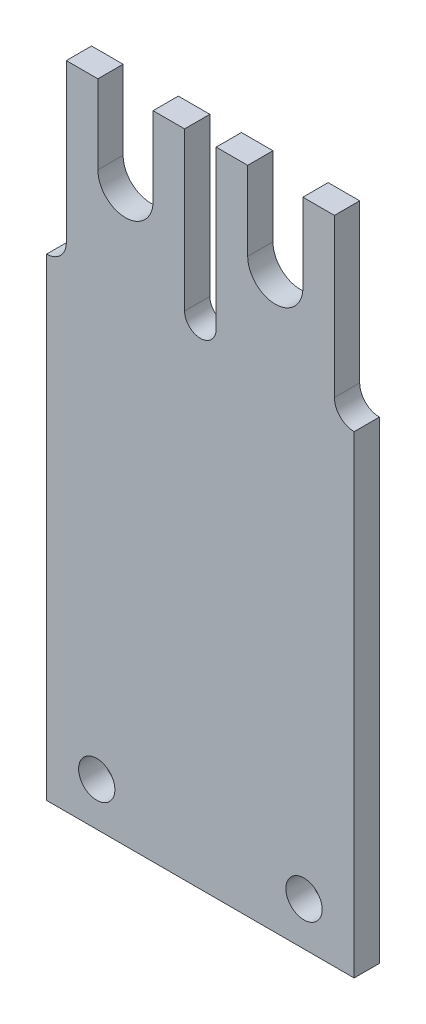
ISO-10303-21;
HEADER;
FILE_DESCRIPTION(('STEP AP214'),'2;1');
FILE_NAME('part.step','',(''),(''),'','','');
FILE_SCHEMA(('AUTOMOTIVE_DESIGN { 1 0 10303 214 1 1 1 1 }'));
ENDSEC;
DATA;
#1=APPLICATION_CONTEXT('core data for automotive mechanical design processes');
#2=APPLICATION_PROTOCOL_DEFINITION('international standard','automotive_design',2000,#1);
#3=PRODUCT_CONTEXT('',#1,'mechanical');
#4=PRODUCT('Part','Part','',(#3));
#5=PRODUCT_RELATED_PRODUCT_CATEGORY('part','',(#4));
#6=PRODUCT_DEFINITION_FORMATION('','',#4);
#7=PRODUCT_DEFINITION_CONTEXT('part definition',#1,'design');
#8=PRODUCT_DEFINITION('design','',#6,#7);
#9=PRODUCT_DEFINITION_SHAPE('','',#8);
#10=(LENGTH_UNIT() NAMED_UNIT(*) SI_UNIT(.MILLI.,.METRE.));
#11=(NAMED_UNIT(*) PLANE_ANGLE_UNIT() SI_UNIT($,.RADIAN.));
#12=(NAMED_UNIT(*) SI_UNIT($,.STERADIAN.) SOLID_ANGLE_UNIT());
#13=UNCERTAINTY_MEASURE_WITH_UNIT(LENGTH_MEASURE(1.E-05),#10,'distance_accuracy_value','');
#14=(GEOMETRIC_REPRESENTATION_CONTEXT(3) GLOBAL_UNCERTAINTY_ASSIGNED_CONTEXT((#13)) GLOBAL_UNIT_ASSIGNED_CONTEXT((#10,
#11,#12)) REPRESENTATION_CONTEXT('',''));
#15=CARTESIAN_POINT('',(0.,0.,0.));
#16=DIRECTION('',(0.,0.,1.));
#17=DIRECTION('',(1.,0.,0.));
#18=AXIS2_PLACEMENT_3D('',#15,#16,#17);
#19=CARTESIAN_POINT('',(-9.75000082,-30.25000046,1.60143952));
#20=DIRECTION('',(0.,0.,1.));
#21=DIRECTION('',(1.,0.,0.));
#22=AXIS2_PLACEMENT_3D('',#19,#20,#21);
#23=PLANE('',#22);
#24=CARTESIAN_POINT('',(6.56999702,-27.4999958,1.60143952));
#25=DIRECTION('',(0.,0.,-1.));
#26=DIRECTION('',(-1.,0.,0.));
#27=AXIS2_PLACEMENT_3D('',#24,#25,#26);
#28=CIRCLE('',#27,1.15000024);
#29=CARTESIAN_POINT('',(5.41999678,-27.4999958,1.60143952));
#30=VERTEX_POINT('',#29);
#31=EDGE_CURVE('E170',#30,#30,#28,.T.);
#32=ORIENTED_EDGE('',*,*,#31,.T.);
#33=EDGE_LOOP('',(#32));
#34=FACE_BOUND('',#33,.T.);
#35=CARTESIAN_POINT('',(-6.5700021,-27.4999958,1.60143952));
#36=DIRECTION('',(0.,0.,-1.));
#37=DIRECTION('',(-1.,0.,0.));
#38=AXIS2_PLACEMENT_3D('',#35,#36,#37);
#39=CIRCLE('',#38,1.15000024);
#40=CARTESIAN_POINT('',(-7.72000234,-27.4999958,1.60143952));
#41=VERTEX_POINT('',#40);
#42=EDGE_CURVE('E240',#41,#41,#39,.T.);
#43=ORIENTED_EDGE('',*,*,#42,.T.);
#44=EDGE_LOOP('',(#43));
#45=FACE_BOUND('',#44,.T.);
#46=CARTESIAN_POINT('',(-9.749997626926,0.999997346926,1.60143952));
#47=DIRECTION('',(0.,0.,-1.));
#48=DIRECTION('',(-1.,0.,0.));
#49=AXIS2_PLACEMENT_3D('',#46,#47,#48);
#50=CIRCLE('',#49,1.24999684693);
#51=CARTESIAN_POINT('',(-8.50000078000004,0.999998943463,1.60143952));
#52=VERTEX_POINT('',#51);
#53=CARTESIAN_POINT('',(-9.75000082,-0.249999499999961,1.60143952));
#54=VERTEX_POINT('',#53);
#55=EDGE_CURVE('E178',#52,#54,#50,.T.);
#56=ORIENTED_EDGE('',*,*,#55,.T.);
#57=DIRECTION('',(0.,1.,0.));
#58=VECTOR('',#57,1.);
#59=CARTESIAN_POINT('',(-9.75000082,-30.25000046,1.60143952));
#60=LINE('',#59,#58);
#61=CARTESIAN_POINT('',(-9.75000082,-30.25000046,1.60143952));
#62=VERTEX_POINT('',#61);
#63=EDGE_CURVE('E177',#62,#54,#60,.T.);
#64=ORIENTED_EDGE('',*,*,#63,.F.);
#65=DIRECTION('',(1.,0.,0.));
#66=VECTOR('',#65,1.);
#67=CARTESIAN_POINT('',(9.75000082,-30.25000046,1.60143952));
#68=LINE('',#67,#66);
#69=CARTESIAN_POINT('',(9.75000082,-30.25000046,1.60143952));
#70=VERTEX_POINT('',#69);
#71=EDGE_CURVE('E175',#70,#62,#68,.F.);
#72=ORIENTED_EDGE('',*,*,#71,.F.);
#73=DIRECTION('',(0.,1.,0.));
#74=VECTOR('',#73,1.);
#75=CARTESIAN_POINT('',(9.75000082,-0.2499995,1.60143952));
#76=LINE('',#75,#74);
#77=CARTESIAN_POINT('',(9.75000082,-0.249999499999922,1.60143952));
#78=VERTEX_POINT('',#77);
#79=EDGE_CURVE('E112',#78,#70,#76,.F.);
#80=ORIENTED_EDGE('',*,*,#79,.F.);
#81=CARTESIAN_POINT('',(9.749997626926,0.999997346926,1.60143952));
#82=DIRECTION('',(0.,0.,-1.));
#83=DIRECTION('',(-1.,0.,0.));
#84=AXIS2_PLACEMENT_3D('',#81,#82,#83);
#85=CIRCLE('',#84,1.24999684693);
#86=CARTESIAN_POINT('',(8.50000078,0.999998943463,1.60143952));
#87=VERTEX_POINT('',#86);
#88=EDGE_CURVE('E20',#78,#87,#85,.T.);
#89=ORIENTED_EDGE('',*,*,#88,.T.);
#90=DIRECTION('',(0.,1.,0.));
#91=VECTOR('',#90,1.);
#92=CARTESIAN_POINT('',(8.50000078,11.00000086,1.60143952));
#93=LINE('',#92,#91);
#94=CARTESIAN_POINT('',(8.50000078,11.00000086,1.60143952));
#95=VERTEX_POINT('',#94);
#96=EDGE_CURVE('E328',#95,#87,#93,.F.);
#97=ORIENTED_EDGE('',*,*,#96,.F.);
#98=DIRECTION('',(1.,0.,0.));
#99=VECTOR('',#98,1.);
#100=CARTESIAN_POINT('',(6.4999997,11.00000086,1.60143952));
#101=LINE('',#100,#99);
#102=CARTESIAN_POINT('',(6.4999997,11.00000086,1.60143952));
#103=VERTEX_POINT('',#102);
#104=EDGE_CURVE('E323',#103,#95,#101,.T.);
#105=ORIENTED_EDGE('',*,*,#104,.F.);
#106=DIRECTION('',(0.,1.,0.));
#107=VECTOR('',#106,1.);
#108=CARTESIAN_POINT('',(6.4999997,6.0000007,1.60143952));
#109=LINE('',#108,#107);
#110=CARTESIAN_POINT('',(6.4999997,6.0000007,1.60143952));
#111=VERTEX_POINT('',#110);
#112=EDGE_CURVE('E314',#111,#103,#109,.T.);
#113=ORIENTED_EDGE('',*,*,#112,.F.);
#114=CARTESIAN_POINT('',(4.75000066,6.0000007,1.60143952));
#115=DIRECTION('',(0.,0.,-1.));
#116=DIRECTION('',(-1.,0.,0.));
#117=AXIS2_PLACEMENT_3D('',#114,#115,#116);
#118=CIRCLE('',#117,1.74999904);
#119=CARTESIAN_POINT('',(3.00000162000023,6.00000025550026,1.60143952));
#120=VERTEX_POINT('',#119);
#121=EDGE_CURVE('E311',#111,#120,#118,.T.);
#122=ORIENTED_EDGE('',*,*,#121,.T.);
#123=DIRECTION('',(-5.07999983765134E-07,0.999999999999871,0.));
#124=VECTOR('',#123,1.);
#125=CARTESIAN_POINT('',(2.99999908,11.00000086,1.60143952));
#126=LINE('',#125,#124);
#127=CARTESIAN_POINT('',(2.99999908,11.00000086,1.60143952));
#128=VERTEX_POINT('',#127);
#129=EDGE_CURVE('E307',#128,#120,#126,.F.);
#130=ORIENTED_EDGE('',*,*,#129,.F.);
#131=DIRECTION('',(1.,0.,0.));
#132=VECTOR('',#131,1.);
#133=CARTESIAN_POINT('',(1.00000054,11.00000086,1.60143952));
#134=LINE('',#133,#132);
#135=CARTESIAN_POINT('',(1.00000054,11.00000086,1.60143952));
#136=VERTEX_POINT('',#135);
#137=EDGE_CURVE('E302',#136,#128,#134,.T.);
#138=ORIENTED_EDGE('',*,*,#137,.F.);
#139=DIRECTION('',(0.,1.,0.));
#140=VECTOR('',#139,1.);
#141=CARTESIAN_POINT('',(1.00000054,1.00000054,1.60143952));
#142=LINE('',#141,#140);
#143=CARTESIAN_POINT('',(1.00000054,1.00000054,1.60143952));
#144=VERTEX_POINT('',#143);
#145=EDGE_CURVE('E293',#144,#136,#142,.T.);
#146=ORIENTED_EDGE('',*,*,#145,.F.);
#147=CARTESIAN_POINT('',(0.,1.00000054,1.60143952));
#148=DIRECTION('',(0.,0.,-1.));
#149=DIRECTION('',(-1.,0.,0.));
#150=AXIS2_PLACEMENT_3D('',#147,#148,#149);
#151=CIRCLE('',#150,1.00000054);
#152=CARTESIAN_POINT('',(-1.00000054,1.00000054,1.60143952));
#153=VERTEX_POINT('',#152);
#154=EDGE_CURVE('E290',#144,#153,#151,.T.);
#155=ORIENTED_EDGE('',*,*,#154,.T.);
#156=DIRECTION('',(0.,1.,0.));
#157=VECTOR('',#156,1.);
#158=CARTESIAN_POINT('',(-1.00000054,11.00000086,1.60143952));
#159=LINE('',#158,#157);
#160=CARTESIAN_POINT('',(-1.00000054,11.00000086,1.60143952));
#161=VERTEX_POINT('',#160);
#162=EDGE_CURVE('E286',#161,#153,#159,.F.);
#163=ORIENTED_EDGE('',*,*,#162,.F.);
#164=DIRECTION('',(1.,0.,0.));
#165=VECTOR('',#164,1.);
#166=CARTESIAN_POINT('',(-3.00000162,11.00000086,1.60143952));
#167=LINE('',#166,#165);
#168=CARTESIAN_POINT('',(-3.00000162,11.00000086,1.60143952));
#169=VERTEX_POINT('',#168);
#170=EDGE_CURVE('E281',#169,#161,#167,.T.);
#171=ORIENTED_EDGE('',*,*,#170,.F.);
#172=DIRECTION('',(0.,1.,0.));
#173=VECTOR('',#172,1.);
#174=CARTESIAN_POINT('',(-3.00000162,6.0000007,1.60143952));
#175=LINE('',#174,#173);
#176=CARTESIAN_POINT('',(-3.00000162,6.0000007,1.60143952));
#177=VERTEX_POINT('',#176);
#178=EDGE_CURVE('E272',#177,#169,#175,.T.);
#179=ORIENTED_EDGE('',*,*,#178,.F.);
#180=CARTESIAN_POINT('',(-4.75000066,6.0000007,1.60143952));
#181=DIRECTION('',(0.,0.,-1.));
#182=DIRECTION('',(-1.,0.,0.));
#183=AXIS2_PLACEMENT_3D('',#180,#181,#182);
#184=CIRCLE('',#183,1.74999904);
#185=CARTESIAN_POINT('',(-6.4999997,6.0000007,1.60143952));
#186=VERTEX_POINT('',#185);
#187=EDGE_CURVE('E269',#177,#186,#184,.T.);
#188=ORIENTED_EDGE('',*,*,#187,.T.);
#189=DIRECTION('',(0.,1.,0.));
#190=VECTOR('',#189,1.);
#191=CARTESIAN_POINT('',(-6.4999997,11.00000086,1.60143952));
#192=LINE('',#191,#190);
#193=CARTESIAN_POINT('',(-6.4999997,11.00000086,1.60143952));
#194=VERTEX_POINT('',#193);
#195=EDGE_CURVE('E265',#194,#186,#192,.F.);
#196=ORIENTED_EDGE('',*,*,#195,.F.);
#197=DIRECTION('',(1.,0.,0.));
#198=VECTOR('',#197,1.);
#199=CARTESIAN_POINT('',(-8.50000078,11.00000086,1.60143952));
#200=LINE('',#199,#198);
#201=CARTESIAN_POINT('',(-8.50000078,11.00000086,1.60143952));
#202=VERTEX_POINT('',#201);
#203=EDGE_CURVE('E260',#202,#194,#200,.T.);
#204=ORIENTED_EDGE('',*,*,#203,.F.);
#205=DIRECTION('',(0.,1.,0.));
#206=VECTOR('',#205,1.);
#207=CARTESIAN_POINT('',(-8.50000078,1.00000054,1.60143952));
#208=LINE('',#207,#206);
#209=EDGE_CURVE('E251',#52,#202,#208,.T.);
#210=ORIENTED_EDGE('',*,*,#209,.F.);
#211=EDGE_LOOP('',(#56,#64,#72,#80,#89,#97,#105,#113,#122,#130,#138,#146,#155,#163,#171,#179,
#188,#196,#204,#210));
#212=FACE_BOUND('',#211,.T.);
#213=ADVANCED_FACE('F17',(#34,#45,#212),#23,.T.);
#214=CARTESIAN_POINT('',(9.75000082,-30.25000046,0.));
#215=DIRECTION('',(0.,-1.,0.));
#216=DIRECTION('',(0.,0.,-1.));
#217=AXIS2_PLACEMENT_3D('',#214,#215,#216);
#218=PLANE('',#217);
#219=DIRECTION('',(0.,0.,1.));
#220=VECTOR('',#219,1.);
#221=CARTESIAN_POINT('',(-9.75000082,-30.25000046,0.));
#222=LINE('',#221,#220);
#223=CARTESIAN_POINT('',(-9.75000082,-30.25000046,0.));
#224=VERTEX_POINT('',#223);
#225=EDGE_CURVE('E173',#224,#62,#222,.T.);
#226=ORIENTED_EDGE('',*,*,#225,.F.);
#227=DIRECTION('',(1.,0.,0.));
#228=VECTOR('',#227,1.);
#229=CARTESIAN_POINT('',(-9.75000082,-30.25000046,0.));
#230=LINE('',#229,#228);
#231=CARTESIAN_POINT('',(9.75000082,-30.25000046,0.));
#232=VERTEX_POINT('',#231);
#233=EDGE_CURVE('E159',#224,#232,#230,.T.);
#234=ORIENTED_EDGE('',*,*,#233,.T.);
#235=DIRECTION('',(0.,0.,-1.));
#236=VECTOR('',#235,1.);
#237=CARTESIAN_POINT('',(9.75000082,-30.25000046,0.));
#238=LINE('',#237,#236);
#239=EDGE_CURVE('E331',#70,#232,#238,.T.);
#240=ORIENTED_EDGE('',*,*,#239,.F.);
#241=ORIENTED_EDGE('',*,*,#71,.T.);
#242=EDGE_LOOP('',(#226,#234,#240,#241));
#243=FACE_BOUND('',#242,.T.);
#244=ADVANCED_FACE('F174',(#243),#218,.T.);
#245=CARTESIAN_POINT('',(9.75000082,-0.2499995,0.));
#246=DIRECTION('',(1.,0.,0.));
#247=DIRECTION('',(0.,0.,-1.));
#248=AXIS2_PLACEMENT_3D('',#245,#246,#247);
#249=PLANE('',#248);
#250=ORIENTED_EDGE('',*,*,#239,.T.);
#251=DIRECTION('',(0.,1.,0.));
#252=VECTOR('',#251,1.);
#253=CARTESIAN_POINT('',(9.75000082,-30.25000046,0.));
#254=LINE('',#253,#252);
#255=CARTESIAN_POINT('',(9.75000082,-0.249999499999922,0.));
#256=VERTEX_POINT('',#255);
#257=EDGE_CURVE('E167',#232,#256,#254,.T.);
#258=ORIENTED_EDGE('',*,*,#257,.T.);
#259=DIRECTION('',(0.,0.,-1.));
#260=VECTOR('',#259,1.);
#261=CARTESIAN_POINT('',(9.75000082,-0.249999499999922,0.));
#262=LINE('',#261,#260);
#263=EDGE_CURVE('E329',#256,#78,#262,.F.);
#264=ORIENTED_EDGE('',*,*,#263,.T.);
#265=ORIENTED_EDGE('',*,*,#79,.T.);
#266=EDGE_LOOP('',(#250,#258,#264,#265));
#267=FACE_BOUND('',#266,.T.);
#268=ADVANCED_FACE('F501',(#267),#249,.T.);
#269=CARTESIAN_POINT('',(9.749997626926,0.999997346926,0.));
#270=DIRECTION('',(0.,0.,-1.));
#271=DIRECTION('',(-1.,0.,0.));
#272=AXIS2_PLACEMENT_3D('',#269,#270,#271);
#273=CYLINDRICAL_SURFACE('',#272,1.24999684693);
#274=ORIENTED_EDGE('',*,*,#88,.F.);
#275=ORIENTED_EDGE('',*,*,#263,.F.);
#276=CARTESIAN_POINT('',(9.749997626926,0.999997346926,0.));
#277=DIRECTION('',(0.,0.,-1.));
#278=DIRECTION('',(-1.,0.,0.));
#279=AXIS2_PLACEMENT_3D('',#276,#277,#278);
#280=CIRCLE('',#279,1.24999684693);
#281=CARTESIAN_POINT('',(8.50000078,0.999998943463,0.));
#282=VERTEX_POINT('',#281);
#283=EDGE_CURVE('E234',#256,#282,#280,.T.);
#284=ORIENTED_EDGE('',*,*,#283,.T.);
#285=DIRECTION('',(0.,0.,-1.));
#286=VECTOR('',#285,1.);
#287=CARTESIAN_POINT('',(8.50000078,1.00000054,0.));
#288=LINE('',#287,#286);
#289=EDGE_CURVE('E326',#87,#282,#288,.T.);
#290=ORIENTED_EDGE('',*,*,#289,.F.);
#291=EDGE_LOOP('',(#274,#275,#284,#290));
#292=FACE_BOUND('',#291,.T.);
#293=ADVANCED_FACE('F503',(#292),#273,.F.);
#294=CARTESIAN_POINT('',(8.50000078,11.00000086,0.));
#295=DIRECTION('',(1.,0.,0.));
#296=DIRECTION('',(0.,0.,-1.));
#297=AXIS2_PLACEMENT_3D('',#294,#295,#296);
#298=PLANE('',#297);
#299=ORIENTED_EDGE('',*,*,#289,.T.);
#300=DIRECTION('',(0.,1.,0.));
#301=VECTOR('',#300,1.);
#302=CARTESIAN_POINT('',(8.50000078,-30.25000046,0.));
#303=LINE('',#302,#301);
#304=CARTESIAN_POINT('',(8.50000078,11.00000086,0.));
#305=VERTEX_POINT('',#304);
#306=EDGE_CURVE('E231',#282,#305,#303,.T.);
#307=ORIENTED_EDGE('',*,*,#306,.T.);
#308=DIRECTION('',(0.,0.,1.));
#309=VECTOR('',#308,1.);
#310=CARTESIAN_POINT('',(8.50000078,11.00000086,0.));
#311=LINE('',#310,#309);
#312=EDGE_CURVE('E321',#95,#305,#311,.F.);
#313=ORIENTED_EDGE('',*,*,#312,.F.);
#314=ORIENTED_EDGE('',*,*,#96,.T.);
#315=EDGE_LOOP('',(#299,#307,#313,#314));
#316=FACE_BOUND('',#315,.T.);
#317=ADVANCED_FACE('F509',(#316),#298,.T.);
#318=CARTESIAN_POINT('',(6.4999997,11.00000086,0.));
#319=DIRECTION('',(0.,1.,0.));
#320=DIRECTION('',(0.,0.,1.));
#321=AXIS2_PLACEMENT_3D('',#318,#319,#320);
#322=PLANE('',#321);
#323=ORIENTED_EDGE('',*,*,#312,.T.);
#324=DIRECTION('',(1.,0.,0.));
#325=VECTOR('',#324,1.);
#326=CARTESIAN_POINT('',(-9.75000082,11.00000086,0.));
#327=LINE('',#326,#325);
#328=CARTESIAN_POINT('',(6.4999997,11.00000086,0.));
#329=VERTEX_POINT('',#328);
#330=EDGE_CURVE('E228',#305,#329,#327,.F.);
#331=ORIENTED_EDGE('',*,*,#330,.T.);
#332=DIRECTION('',(0.,0.,1.));
#333=VECTOR('',#332,1.);
#334=CARTESIAN_POINT('',(6.4999997,11.00000086,0.));
#335=LINE('',#334,#333);
#336=EDGE_CURVE('E312',#103,#329,#335,.F.);
#337=ORIENTED_EDGE('',*,*,#336,.F.);
#338=ORIENTED_EDGE('',*,*,#104,.T.);
#339=EDGE_LOOP('',(#323,#331,#337,#338));
#340=FACE_BOUND('',#339,.T.);
#341=ADVANCED_FACE('F513',(#340),#322,.T.);
#342=CARTESIAN_POINT('',(6.4999997,6.0000007,0.));
#343=DIRECTION('',(-1.,0.,0.));
#344=DIRECTION('',(0.,0.,1.));
#345=AXIS2_PLACEMENT_3D('',#342,#343,#344);
#346=PLANE('',#345);
#347=ORIENTED_EDGE('',*,*,#336,.T.);
#348=DIRECTION('',(0.,1.,0.));
#349=VECTOR('',#348,1.);
#350=CARTESIAN_POINT('',(6.4999997,-30.25000046,0.));
#351=LINE('',#350,#349);
#352=CARTESIAN_POINT('',(6.4999997,6.0000007,0.));
#353=VERTEX_POINT('',#352);
#354=EDGE_CURVE('E225',#329,#353,#351,.F.);
#355=ORIENTED_EDGE('',*,*,#354,.T.);
#356=DIRECTION('',(0.,0.,-1.));
#357=VECTOR('',#356,1.);
#358=CARTESIAN_POINT('',(6.4999997,6.0000007,0.));
#359=LINE('',#358,#357);
#360=EDGE_CURVE('E308',#353,#111,#359,.F.);
#361=ORIENTED_EDGE('',*,*,#360,.T.);
#362=ORIENTED_EDGE('',*,*,#112,.T.);
#363=EDGE_LOOP('',(#347,#355,#361,#362));
#364=FACE_BOUND('',#363,.T.);
#365=ADVANCED_FACE('F515',(#364),#346,.T.);
#366=CARTESIAN_POINT('',(4.75000066,6.0000007,0.));
#367=DIRECTION('',(0.,0.,-1.));
#368=DIRECTION('',(-1.,0.,0.));
#369=AXIS2_PLACEMENT_3D('',#366,#367,#368);
#370=CYLINDRICAL_SURFACE('',#369,1.74999904);
#371=ORIENTED_EDGE('',*,*,#121,.F.);
#372=ORIENTED_EDGE('',*,*,#360,.F.);
#373=CARTESIAN_POINT('',(4.75000066,6.0000007,0.));
#374=DIRECTION('',(0.,0.,-1.));
#375=DIRECTION('',(-1.,0.,0.));
#376=AXIS2_PLACEMENT_3D('',#373,#374,#375);
#377=CIRCLE('',#376,1.74999904);
#378=CARTESIAN_POINT('',(3.00000162,6.0000007,0.));
#379=VERTEX_POINT('',#378);
#380=EDGE_CURVE('E222',#353,#379,#377,.T.);
#381=ORIENTED_EDGE('',*,*,#380,.T.);
#382=DIRECTION('',(0.,0.,1.));
#383=VECTOR('',#382,1.);
#384=CARTESIAN_POINT('',(3.00000162,6.0000007,0.));
#385=LINE('',#384,#383);
#386=EDGE_CURVE('E305',#120,#379,#385,.F.);
#387=ORIENTED_EDGE('',*,*,#386,.F.);
#388=EDGE_LOOP('',(#371,#372,#381,#387));
#389=FACE_BOUND('',#388,.T.);
#390=ADVANCED_FACE('F405',(#389),#370,.F.);
#391=CARTESIAN_POINT('',(2.99999908,11.00000086,0.));
#392=DIRECTION('',(0.999999999999871,5.07999983765134E-07,0.));
#393=DIRECTION('',(-5.07999983765134E-07,0.999999999999871,0.));
#394=AXIS2_PLACEMENT_3D('',#391,#392,#393);
#395=PLANE('',#394);
#396=ORIENTED_EDGE('',*,*,#386,.T.);
#397=DIRECTION('',(0.,1.,0.));
#398=VECTOR('',#397,1.);
#399=CARTESIAN_POINT('',(3.00000162,-30.25000046,0.));
#400=LINE('',#399,#398);
#401=CARTESIAN_POINT('',(3.00000077333333,11.00000086,0.));
#402=VERTEX_POINT('',#401);
#403=EDGE_CURVE('E219',#379,#402,#400,.T.);
#404=ORIENTED_EDGE('',*,*,#403,.T.);
#405=DIRECTION('',(0.,0.,1.));
#406=VECTOR('',#405,1.);
#407=CARTESIAN_POINT('',(2.99999908,11.00000086,0.));
#408=LINE('',#407,#406);
#409=EDGE_CURVE('E300',#128,#402,#408,.F.);
#410=ORIENTED_EDGE('',*,*,#409,.F.);
#411=ORIENTED_EDGE('',*,*,#129,.T.);
#412=EDGE_LOOP('',(#396,#404,#410,#411));
#413=FACE_BOUND('',#412,.T.);
#414=ADVANCED_FACE('F409',(#413),#395,.T.);
#415=CARTESIAN_POINT('',(1.00000054,11.00000086,0.));
#416=DIRECTION('',(0.,1.,0.));
#417=DIRECTION('',(0.,0.,1.));
#418=AXIS2_PLACEMENT_3D('',#415,#416,#417);
#419=PLANE('',#418);
#420=ORIENTED_EDGE('',*,*,#409,.T.);
#421=DIRECTION('',(1.,0.,0.));
#422=VECTOR('',#421,1.);
#423=CARTESIAN_POINT('',(-9.75000082,11.00000086,0.));
#424=LINE('',#423,#422);
#425=CARTESIAN_POINT('',(1.00000054,11.00000086,0.));
#426=VERTEX_POINT('',#425);
#427=EDGE_CURVE('E216',#402,#426,#424,.F.);
#428=ORIENTED_EDGE('',*,*,#427,.T.);
#429=DIRECTION('',(0.,0.,1.));
#430=VECTOR('',#429,1.);
#431=CARTESIAN_POINT('',(1.00000054,11.00000086,0.));
#432=LINE('',#431,#430);
#433=EDGE_CURVE('E291',#136,#426,#432,.F.);
#434=ORIENTED_EDGE('',*,*,#433,.F.);
#435=ORIENTED_EDGE('',*,*,#137,.T.);
#436=EDGE_LOOP('',(#420,#428,#434,#435));
#437=FACE_BOUND('',#436,.T.);
#438=ADVANCED_FACE('F416',(#437),#419,.T.);
#439=CARTESIAN_POINT('',(1.00000054,1.00000054,0.));
#440=DIRECTION('',(-1.,0.,0.));
#441=DIRECTION('',(0.,0.,1.));
#442=AXIS2_PLACEMENT_3D('',#439,#440,#441);
#443=PLANE('',#442);
#444=ORIENTED_EDGE('',*,*,#433,.T.);
#445=DIRECTION('',(0.,1.,0.));
#446=VECTOR('',#445,1.);
#447=CARTESIAN_POINT('',(1.00000054,-30.25000046,0.));
#448=LINE('',#447,#446);
#449=CARTESIAN_POINT('',(1.00000054,1.00000054,0.));
#450=VERTEX_POINT('',#449);
#451=EDGE_CURVE('E213',#426,#450,#448,.F.);
#452=ORIENTED_EDGE('',*,*,#451,.T.);
#453=DIRECTION('',(0.,0.,-1.));
#454=VECTOR('',#453,1.);
#455=CARTESIAN_POINT('',(1.00000054,1.00000054,0.));
#456=LINE('',#455,#454);
#457=EDGE_CURVE('E287',#450,#144,#456,.F.);
#458=ORIENTED_EDGE('',*,*,#457,.T.);
#459=ORIENTED_EDGE('',*,*,#145,.T.);
#460=EDGE_LOOP('',(#444,#452,#458,#459));
#461=FACE_BOUND('',#460,.T.);
#462=ADVANCED_FACE('F423',(#461),#443,.T.);
#463=CARTESIAN_POINT('',(0.,1.00000054,0.));
#464=DIRECTION('',(0.,0.,-1.));
#465=DIRECTION('',(-1.,0.,0.));
#466=AXIS2_PLACEMENT_3D('',#463,#464,#465);
#467=CYLINDRICAL_SURFACE('',#466,1.00000054);
#468=ORIENTED_EDGE('',*,*,#154,.F.);
#469=ORIENTED_EDGE('',*,*,#457,.F.);
#470=CARTESIAN_POINT('',(0.,1.00000054,0.));
#471=DIRECTION('',(0.,0.,-1.));
#472=DIRECTION('',(-1.,0.,0.));
#473=AXIS2_PLACEMENT_3D('',#470,#471,#472);
#474=CIRCLE('',#473,1.00000054);
#475=CARTESIAN_POINT('',(-1.00000054,1.00000054,0.));
#476=VERTEX_POINT('',#475);
#477=EDGE_CURVE('E210',#450,#476,#474,.T.);
#478=ORIENTED_EDGE('',*,*,#477,.T.);
#479=DIRECTION('',(0.,0.,-1.));
#480=VECTOR('',#479,1.);
#481=CARTESIAN_POINT('',(-1.00000054,1.00000054,0.));
#482=LINE('',#481,#480);
#483=EDGE_CURVE('E284',#153,#476,#482,.T.);
#484=ORIENTED_EDGE('',*,*,#483,.F.);
#485=EDGE_LOOP('',(#468,#469,#478,#484));
#486=FACE_BOUND('',#485,.T.);
#487=ADVANCED_FACE('F422',(#486),#467,.F.);
#488=CARTESIAN_POINT('',(-1.00000054,11.00000086,0.));
#489=DIRECTION('',(1.,0.,0.));
#490=DIRECTION('',(0.,0.,-1.));
#491=AXIS2_PLACEMENT_3D('',#488,#489,#490);
#492=PLANE('',#491);
#493=ORIENTED_EDGE('',*,*,#483,.T.);
#494=DIRECTION('',(0.,1.,0.));
#495=VECTOR('',#494,1.);
#496=CARTESIAN_POINT('',(-1.00000054,-30.25000046,0.));
#497=LINE('',#496,#495);
#498=CARTESIAN_POINT('',(-1.00000054,11.00000086,0.));
#499=VERTEX_POINT('',#498);
#500=EDGE_CURVE('E207',#476,#499,#497,.T.);
#501=ORIENTED_EDGE('',*,*,#500,.T.);
#502=DIRECTION('',(0.,0.,1.));
#503=VECTOR('',#502,1.);
#504=CARTESIAN_POINT('',(-1.00000054,11.00000086,0.));
#505=LINE('',#504,#503);
#506=EDGE_CURVE('E279',#161,#499,#505,.F.);
#507=ORIENTED_EDGE('',*,*,#506,.F.);
#508=ORIENTED_EDGE('',*,*,#162,.T.);
#509=EDGE_LOOP('',(#493,#501,#507,#508));
#510=FACE_BOUND('',#509,.T.);
#511=ADVANCED_FACE('F431',(#510),#492,.T.);
#512=CARTESIAN_POINT('',(-3.00000162,11.00000086,0.));
#513=DIRECTION('',(0.,1.,0.));
#514=DIRECTION('',(0.,0.,1.));
#515=AXIS2_PLACEMENT_3D('',#512,#513,#514);
#516=PLANE('',#515);
#517=ORIENTED_EDGE('',*,*,#506,.T.);
#518=DIRECTION('',(1.,0.,0.));
#519=VECTOR('',#518,1.);
#520=CARTESIAN_POINT('',(-9.75000082,11.00000086,0.));
#521=LINE('',#520,#519);
#522=CARTESIAN_POINT('',(-3.00000162,11.00000086,0.));
#523=VERTEX_POINT('',#522);
#524=EDGE_CURVE('E204',#499,#523,#521,.F.);
#525=ORIENTED_EDGE('',*,*,#524,.T.);
#526=DIRECTION('',(0.,0.,1.));
#527=VECTOR('',#526,1.);
#528=CARTESIAN_POINT('',(-3.00000162,11.00000086,0.));
#529=LINE('',#528,#527);
#530=EDGE_CURVE('E270',#169,#523,#529,.F.);
#531=ORIENTED_EDGE('',*,*,#530,.F.);
#532=ORIENTED_EDGE('',*,*,#170,.T.);
#533=EDGE_LOOP('',(#517,#525,#531,#532));
#534=FACE_BOUND('',#533,.T.);
#535=ADVANCED_FACE('F475',(#534),#516,.T.);
#536=CARTESIAN_POINT('',(-3.00000162,6.0000007,0.));
#537=DIRECTION('',(-1.,0.,0.));
#538=DIRECTION('',(0.,0.,1.));
#539=AXIS2_PLACEMENT_3D('',#536,#537,#538);
#540=PLANE('',#539);
#541=ORIENTED_EDGE('',*,*,#530,.T.);
#542=DIRECTION('',(0.,1.,0.));
#543=VECTOR('',#542,1.);
#544=CARTESIAN_POINT('',(-3.00000162,-30.25000046,0.));
#545=LINE('',#544,#543);
#546=CARTESIAN_POINT('',(-3.00000162,6.0000007,0.));
#547=VERTEX_POINT('',#546);
#548=EDGE_CURVE('E201',#523,#547,#545,.F.);
#549=ORIENTED_EDGE('',*,*,#548,.T.);
#550=DIRECTION('',(0.,0.,-1.));
#551=VECTOR('',#550,1.);
#552=CARTESIAN_POINT('',(-3.00000162,6.0000007,0.));
#553=LINE('',#552,#551);
#554=EDGE_CURVE('E266',#547,#177,#553,.F.);
#555=ORIENTED_EDGE('',*,*,#554,.T.);
#556=ORIENTED_EDGE('',*,*,#178,.T.);
#557=EDGE_LOOP('',(#541,#549,#555,#556));
#558=FACE_BOUND('',#557,.T.);
#559=ADVANCED_FACE('F471',(#558),#540,.T.);
#560=CARTESIAN_POINT('',(-4.75000066,6.0000007,0.));
#561=DIRECTION('',(0.,0.,-1.));
#562=DIRECTION('',(-1.,0.,0.));
#563=AXIS2_PLACEMENT_3D('',#560,#561,#562);
#564=CYLINDRICAL_SURFACE('',#563,1.74999904);
#565=ORIENTED_EDGE('',*,*,#187,.F.);
#566=ORIENTED_EDGE('',*,*,#554,.F.);
#567=CARTESIAN_POINT('',(-4.75000066,6.0000007,0.));
#568=DIRECTION('',(0.,0.,-1.));
#569=DIRECTION('',(-1.,0.,0.));
#570=AXIS2_PLACEMENT_3D('',#567,#568,#569);
#571=CIRCLE('',#570,1.74999904);
#572=CARTESIAN_POINT('',(-6.4999997,6.0000007,0.));
#573=VERTEX_POINT('',#572);
#574=EDGE_CURVE('E198',#547,#573,#571,.T.);
#575=ORIENTED_EDGE('',*,*,#574,.T.);
#576=DIRECTION('',(0.,0.,-1.));
#577=VECTOR('',#576,1.);
#578=CARTESIAN_POINT('',(-6.4999997,6.0000007,0.));
#579=LINE('',#578,#577);
#580=EDGE_CURVE('E263',#186,#573,#579,.T.);
#581=ORIENTED_EDGE('',*,*,#580,.F.);
#582=EDGE_LOOP('',(#565,#566,#575,#581));
#583=FACE_BOUND('',#582,.T.);
#584=ADVANCED_FACE('F467',(#583),#564,.F.);
#585=CARTESIAN_POINT('',(-6.4999997,11.00000086,0.));
#586=DIRECTION('',(1.,0.,0.));
#587=DIRECTION('',(0.,0.,-1.));
#588=AXIS2_PLACEMENT_3D('',#585,#586,#587);
#589=PLANE('',#588);
#590=ORIENTED_EDGE('',*,*,#580,.T.);
#591=DIRECTION('',(0.,1.,0.));
#592=VECTOR('',#591,1.);
#593=CARTESIAN_POINT('',(-6.4999997,-30.25000046,0.));
#594=LINE('',#593,#592);
#595=CARTESIAN_POINT('',(-6.4999997,11.00000086,0.));
#596=VERTEX_POINT('',#595);
#597=EDGE_CURVE('E195',#573,#596,#594,.T.);
#598=ORIENTED_EDGE('',*,*,#597,.T.);
#599=DIRECTION('',(0.,0.,1.));
#600=VECTOR('',#599,1.);
#601=CARTESIAN_POINT('',(-6.4999997,11.00000086,0.));
#602=LINE('',#601,#600);
#603=EDGE_CURVE('E258',#194,#596,#602,.F.);
#604=ORIENTED_EDGE('',*,*,#603,.F.);
#605=ORIENTED_EDGE('',*,*,#195,.T.);
#606=EDGE_LOOP('',(#590,#598,#604,#605));
#607=FACE_BOUND('',#606,.T.);
#608=ADVANCED_FACE('F463',(#607),#589,.T.);
#609=CARTESIAN_POINT('',(-8.50000078,11.00000086,0.));
#610=DIRECTION('',(0.,1.,0.));
#611=DIRECTION('',(0.,0.,1.));
#612=AXIS2_PLACEMENT_3D('',#609,#610,#611);
#613=PLANE('',#612);
#614=ORIENTED_EDGE('',*,*,#603,.T.);
#615=DIRECTION('',(1.,0.,0.));
#616=VECTOR('',#615,1.);
#617=CARTESIAN_POINT('',(-9.75000082,11.00000086,0.));
#618=LINE('',#617,#616);
#619=CARTESIAN_POINT('',(-8.50000078,11.00000086,0.));
#620=VERTEX_POINT('',#619);
#621=EDGE_CURVE('E192',#596,#620,#618,.F.);
#622=ORIENTED_EDGE('',*,*,#621,.T.);
#623=DIRECTION('',(0.,0.,1.));
#624=VECTOR('',#623,1.);
#625=CARTESIAN_POINT('',(-8.50000078,11.00000086,0.));
#626=LINE('',#625,#624);
#627=EDGE_CURVE('E249',#202,#620,#626,.F.);
#628=ORIENTED_EDGE('',*,*,#627,.F.);
#629=ORIENTED_EDGE('',*,*,#203,.T.);
#630=EDGE_LOOP('',(#614,#622,#628,#629));
#631=FACE_BOUND('',#630,.T.);
#632=ADVANCED_FACE('F459',(#631),#613,.T.);
#633=CARTESIAN_POINT('',(-8.50000078,1.00000054,0.));
#634=DIRECTION('',(-1.,0.,0.));
#635=DIRECTION('',(0.,0.,1.));
#636=AXIS2_PLACEMENT_3D('',#633,#634,#635);
#637=PLANE('',#636);
#638=ORIENTED_EDGE('',*,*,#627,.T.);
#639=DIRECTION('',(0.,1.,0.));
#640=VECTOR('',#639,1.);
#641=CARTESIAN_POINT('',(-8.50000078,-30.25000046,0.));
#642=LINE('',#641,#640);
#643=CARTESIAN_POINT('',(-8.50000078000002,0.999998943463,0.));
#644=VERTEX_POINT('',#643);
#645=EDGE_CURVE('E185',#620,#644,#642,.F.);
#646=ORIENTED_EDGE('',*,*,#645,.T.);
#647=DIRECTION('',(0.,0.,-1.));
#648=VECTOR('',#647,1.);
#649=CARTESIAN_POINT('',(-8.50000078000008,1.00000054,0.));
#650=LINE('',#649,#648);
#651=EDGE_CURVE('E246',#644,#52,#650,.F.);
#652=ORIENTED_EDGE('',*,*,#651,.T.);
#653=ORIENTED_EDGE('',*,*,#209,.T.);
#654=EDGE_LOOP('',(#638,#646,#652,#653));
#655=FACE_BOUND('',#654,.T.);
#656=ADVANCED_FACE('F455',(#655),#637,.T.);
#657=CARTESIAN_POINT('',(-9.749997626926,0.999997346926,0.));
#658=DIRECTION('',(0.,0.,-1.));
#659=DIRECTION('',(-1.,0.,0.));
#660=AXIS2_PLACEMENT_3D('',#657,#658,#659);
#661=CYLINDRICAL_SURFACE('',#660,1.24999684693);
#662=ORIENTED_EDGE('',*,*,#55,.F.);
#663=ORIENTED_EDGE('',*,*,#651,.F.);
#664=CARTESIAN_POINT('',(-9.749997626926,0.999997346926,0.));
#665=DIRECTION('',(0.,0.,-1.));
#666=DIRECTION('',(-1.,0.,0.));
#667=AXIS2_PLACEMENT_3D('',#664,#665,#666);
#668=CIRCLE('',#667,1.24999684693);
#669=CARTESIAN_POINT('',(-9.75000082,-0.249999499999961,0.));
#670=VERTEX_POINT('',#669);
#671=EDGE_CURVE('E181',#644,#670,#668,.T.);
#672=ORIENTED_EDGE('',*,*,#671,.T.);
#673=DIRECTION('',(0.,0.,1.));
#674=VECTOR('',#673,1.);
#675=CARTESIAN_POINT('',(-9.75000082,-0.2499995,0.));
#676=LINE('',#675,#674);
#677=EDGE_CURVE('E35',#54,#670,#676,.F.);
#678=ORIENTED_EDGE('',*,*,#677,.F.);
#679=EDGE_LOOP('',(#662,#663,#672,#678));
#680=FACE_BOUND('',#679,.T.);
#681=ADVANCED_FACE('F452',(#680),#661,.F.);
#682=CARTESIAN_POINT('',(-9.75000082,-30.25000046,0.));
#683=DIRECTION('',(-1.,0.,0.));
#684=DIRECTION('',(0.,0.,1.));
#685=AXIS2_PLACEMENT_3D('',#682,#683,#684);
#686=PLANE('',#685);
#687=ORIENTED_EDGE('',*,*,#677,.T.);
#688=DIRECTION('',(0.,1.,0.));
#689=VECTOR('',#688,1.);
#690=CARTESIAN_POINT('',(-9.75000082,-30.25000046,0.));
#691=LINE('',#690,#689);
#692=EDGE_CURVE('E163',#670,#224,#691,.F.);
#693=ORIENTED_EDGE('',*,*,#692,.T.);
#694=ORIENTED_EDGE('',*,*,#225,.T.);
#695=ORIENTED_EDGE('',*,*,#63,.T.);
#696=EDGE_LOOP('',(#687,#693,#694,#695));
#697=FACE_BOUND('',#696,.T.);
#698=ADVANCED_FACE('F180',(#697),#686,.T.);
#699=CARTESIAN_POINT('',(-6.5700021,-27.4999958,0.));
#700=DIRECTION('',(0.,0.,-1.));
#701=DIRECTION('',(-1.,0.,0.));
#702=AXIS2_PLACEMENT_3D('',#699,#700,#701);
#703=CYLINDRICAL_SURFACE('',#702,1.15000024);
#704=ORIENTED_EDGE('',*,*,#42,.F.);
#705=EDGE_LOOP('',(#704));
#706=FACE_BOUND('',#705,.T.);
#707=CARTESIAN_POINT('',(-6.5700021,-27.4999958,0.));
#708=DIRECTION('',(0.,0.,-1.));
#709=DIRECTION('',(-1.,0.,0.));
#710=AXIS2_PLACEMENT_3D('',#707,#708,#709);
#711=CIRCLE('',#710,1.15000024);
#712=CARTESIAN_POINT('',(-7.72000234,-27.4999958,0.));
#713=VERTEX_POINT('',#712);
#714=EDGE_CURVE('E26',#713,#713,#711,.T.);
#715=ORIENTED_EDGE('',*,*,#714,.T.);
#716=EDGE_LOOP('',(#715));
#717=FACE_BOUND('',#716,.T.);
#718=ADVANCED_FACE('F441',(#706,#717),#703,.F.);
#719=CARTESIAN_POINT('',(6.56999702,-27.4999958,0.));
#720=DIRECTION('',(0.,0.,-1.));
#721=DIRECTION('',(-1.,0.,0.));
#722=AXIS2_PLACEMENT_3D('',#719,#720,#721);
#723=CYLINDRICAL_SURFACE('',#722,1.15000024);
#724=ORIENTED_EDGE('',*,*,#31,.F.);
#725=EDGE_LOOP('',(#724));
#726=FACE_BOUND('',#725,.T.);
#727=CARTESIAN_POINT('',(6.56999702,-27.4999958,0.));
#728=DIRECTION('',(0.,0.,-1.));
#729=DIRECTION('',(-1.,0.,0.));
#730=AXIS2_PLACEMENT_3D('',#727,#728,#729);
#731=CIRCLE('',#730,1.15000024);
#732=CARTESIAN_POINT('',(5.41999678,-27.4999958,0.));
#733=VERTEX_POINT('',#732);
#734=EDGE_CURVE('E11',#733,#733,#731,.T.);
#735=ORIENTED_EDGE('',*,*,#734,.T.);
#736=EDGE_LOOP('',(#735));
#737=FACE_BOUND('',#736,.T.);
#738=ADVANCED_FACE('F435',(#726,#737),#723,.F.);
#739=CARTESIAN_POINT('',(-9.75000082,-30.25000046,0.));
#740=DIRECTION('',(0.,0.,1.));
#741=DIRECTION('',(1.,0.,0.));
#742=AXIS2_PLACEMENT_3D('',#739,#740,#741);
#743=PLANE('',#742);
#744=ORIENTED_EDGE('',*,*,#734,.F.);
#745=EDGE_LOOP('',(#744));
#746=FACE_BOUND('',#745,.T.);
#747=ORIENTED_EDGE('',*,*,#714,.F.);
#748=EDGE_LOOP('',(#747));
#749=FACE_BOUND('',#748,.T.);
#750=ORIENTED_EDGE('',*,*,#671,.F.);
#751=ORIENTED_EDGE('',*,*,#645,.F.);
#752=ORIENTED_EDGE('',*,*,#621,.F.);
#753=ORIENTED_EDGE('',*,*,#597,.F.);
#754=ORIENTED_EDGE('',*,*,#574,.F.);
#755=ORIENTED_EDGE('',*,*,#548,.F.);
#756=ORIENTED_EDGE('',*,*,#524,.F.);
#757=ORIENTED_EDGE('',*,*,#500,.F.);
#758=ORIENTED_EDGE('',*,*,#477,.F.);
#759=ORIENTED_EDGE('',*,*,#451,.F.);
#760=ORIENTED_EDGE('',*,*,#427,.F.);
#761=ORIENTED_EDGE('',*,*,#403,.F.);
#762=ORIENTED_EDGE('',*,*,#380,.F.);
#763=ORIENTED_EDGE('',*,*,#354,.F.);
#764=ORIENTED_EDGE('',*,*,#330,.F.);
#765=ORIENTED_EDGE('',*,*,#306,.F.);
#766=ORIENTED_EDGE('',*,*,#283,.F.);
#767=ORIENTED_EDGE('',*,*,#257,.F.);
#768=ORIENTED_EDGE('',*,*,#233,.F.);
#769=ORIENTED_EDGE('',*,*,#692,.F.);
#770=EDGE_LOOP('',(#750,#751,#752,#753,#754,#755,#756,#757,#758,#759,#760,#761,#762,#763,#764,
#765,#766,#767,#768,#769));
#771=FACE_BOUND('',#770,.T.);
#772=ADVANCED_FACE('F162',(#746,#749,#771),#743,.F.);
#773=CLOSED_SHELL('',(#213,#244,#268,#293,#317,#341,#365,#390,#414,#438,#462,#487,#511,#535,
#559,#584,#608,#632,#656,#681,#698,#718,#738,#772));
#774=MANIFOLD_SOLID_BREP('B1',#773);
#775=ADVANCED_BREP_SHAPE_REPRESENTATION('',(#18,#774),#14);
#776=SHAPE_DEFINITION_REPRESENTATION(#9,#775);
ENDSEC;
END-ISO-10303-21;
